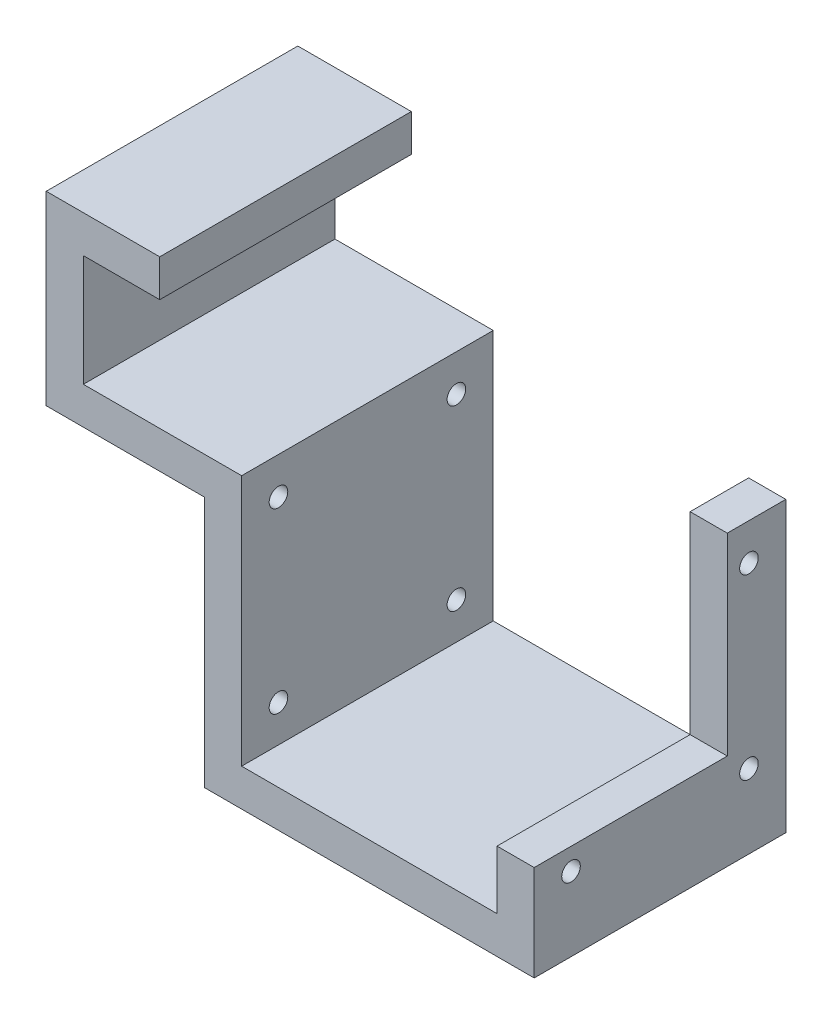
ISO-10303-21;
HEADER;
FILE_DESCRIPTION(('STEP AP214'),'2;1');
FILE_NAME('part.step','',(''),(''),'','','');
FILE_SCHEMA(('AUTOMOTIVE_DESIGN { 1 0 10303 214 1 1 1 1 }'));
ENDSEC;
DATA;
#1=APPLICATION_CONTEXT('core data for automotive mechanical design processes');
#2=APPLICATION_PROTOCOL_DEFINITION('international standard','automotive_design',2000,#1);
#3=PRODUCT_CONTEXT('',#1,'mechanical');
#4=PRODUCT('Part','Part','',(#3));
#5=PRODUCT_RELATED_PRODUCT_CATEGORY('part','',(#4));
#6=PRODUCT_DEFINITION_FORMATION('','',#4);
#7=PRODUCT_DEFINITION_CONTEXT('part definition',#1,'design');
#8=PRODUCT_DEFINITION('design','',#6,#7);
#9=PRODUCT_DEFINITION_SHAPE('','',#8);
#10=(LENGTH_UNIT() NAMED_UNIT(*) SI_UNIT(.MILLI.,.METRE.));
#11=(NAMED_UNIT(*) PLANE_ANGLE_UNIT() SI_UNIT($,.RADIAN.));
#12=(NAMED_UNIT(*) SI_UNIT($,.STERADIAN.) SOLID_ANGLE_UNIT());
#13=UNCERTAINTY_MEASURE_WITH_UNIT(LENGTH_MEASURE(1.E-05),#10,'distance_accuracy_value','');
#14=(GEOMETRIC_REPRESENTATION_CONTEXT(3) GLOBAL_UNCERTAINTY_ASSIGNED_CONTEXT((#13)) GLOBAL_UNIT_ASSIGNED_CONTEXT((#10,
#11,#12)) REPRESENTATION_CONTEXT('',''));
#15=CARTESIAN_POINT('',(0.,0.,0.));
#16=DIRECTION('',(0.,0.,1.));
#17=DIRECTION('',(1.,0.,0.));
#18=AXIS2_PLACEMENT_3D('',#15,#16,#17);
#19=CARTESIAN_POINT('',(-6.35,15.15,-150.351129477058));
#20=DIRECTION('',(0.,1.,0.));
#21=DIRECTION('',(0.,0.,1.));
#22=AXIS2_PLACEMENT_3D('',#19,#20,#21);
#23=PLANE('',#22);
#24=DIRECTION('',(-1.,0.,0.));
#25=VECTOR('',#24,1.);
#26=CARTESIAN_POINT('',(50.,15.15,-38.2923438834319));
#27=LINE('',#26,#25);
#28=CARTESIAN_POINT('',(-19.05,15.15,-38.2923438834319));
#29=VERTEX_POINT('',#28);
#30=CARTESIAN_POINT('',(-6.35,15.15,-38.2923438834319));
#31=VERTEX_POINT('',#30);
#32=EDGE_CURVE('E189',#29,#31,#27,.F.);
#33=ORIENTED_EDGE('',*,*,#32,.F.);
#34=DIRECTION('',(0.,0.,1.));
#35=VECTOR('',#34,1.);
#36=CARTESIAN_POINT('',(-19.05,15.15,-150.351129477058));
#37=LINE('',#36,#35);
#38=CARTESIAN_POINT('',(-19.05,15.15,-35.1193076505862));
#39=VERTEX_POINT('',#38);
#40=EDGE_CURVE('E11',#29,#39,#37,.T.);
#41=ORIENTED_EDGE('',*,*,#40,.T.);
#42=DIRECTION('',(-1.,0.,0.));
#43=VECTOR('',#42,1.);
#44=CARTESIAN_POINT('',(50.,15.15,-35.1193076505862));
#45=LINE('',#44,#43);
#46=CARTESIAN_POINT('',(-6.35,15.15,-35.1193076505862));
#47=VERTEX_POINT('',#46);
#48=EDGE_CURVE('E191',#47,#39,#45,.T.);
#49=ORIENTED_EDGE('',*,*,#48,.F.);
#50=DIRECTION('',(0.,0.,1.));
#51=VECTOR('',#50,1.);
#52=CARTESIAN_POINT('',(-6.35,15.15,-150.351129477058));
#53=LINE('',#52,#51);
#54=CARTESIAN_POINT('',(-6.35,15.15,-7.88069234941382));
#55=VERTEX_POINT('',#54);
#56=EDGE_CURVE('E398',#47,#55,#53,.T.);
#57=ORIENTED_EDGE('',*,*,#56,.T.);
#58=DIRECTION('',(-1.,0.,0.));
#59=VECTOR('',#58,1.);
#60=CARTESIAN_POINT('',(50.,15.15,-7.88069234941382));
#61=LINE('',#60,#59);
#62=CARTESIAN_POINT('',(-19.05,15.15,-7.88069234941382));
#63=VERTEX_POINT('',#62);
#64=EDGE_CURVE('E56',#63,#55,#61,.F.);
#65=ORIENTED_EDGE('',*,*,#64,.F.);
#66=DIRECTION('',(0.,0.,1.));
#67=VECTOR('',#66,1.);
#68=CARTESIAN_POINT('',(-19.05,15.15,-150.351129477058));
#69=LINE('',#68,#67);
#70=CARTESIAN_POINT('',(-19.05,15.15,-4.70765611656815));
#71=VERTEX_POINT('',#70);
#72=EDGE_CURVE('E343',#63,#71,#69,.T.);
#73=ORIENTED_EDGE('',*,*,#72,.T.);
#74=DIRECTION('',(-1.,0.,0.));
#75=VECTOR('',#74,1.);
#76=CARTESIAN_POINT('',(50.,15.15,-4.70765611656815));
#77=LINE('',#76,#75);
#78=CARTESIAN_POINT('',(-6.35,15.15,-4.70765611656815));
#79=VERTEX_POINT('',#78);
#80=EDGE_CURVE('E410',#79,#71,#77,.T.);
#81=ORIENTED_EDGE('',*,*,#80,.F.);
#82=CARTESIAN_POINT('',(-6.35,15.15,0.));
#83=VERTEX_POINT('',#82);
#84=EDGE_CURVE('E309',#79,#83,#53,.T.);
#85=ORIENTED_EDGE('',*,*,#84,.T.);
#86=DIRECTION('',(-1.,0.,0.));
#87=VECTOR('',#86,1.);
#88=CARTESIAN_POINT('',(-6.35,15.15,0.));
#89=LINE('',#88,#87);
#90=CARTESIAN_POINT('',(-33.4,15.15,0.));
#91=VERTEX_POINT('',#90);
#92=EDGE_CURVE('E301',#83,#91,#89,.T.);
#93=ORIENTED_EDGE('',*,*,#92,.T.);
#94=DIRECTION('',(0.,0.,1.));
#95=VECTOR('',#94,1.);
#96=CARTESIAN_POINT('',(-33.4,15.15,-150.351129477058));
#97=LINE('',#96,#95);
#98=CARTESIAN_POINT('',(-33.4,15.15,-43.));
#99=VERTEX_POINT('',#98);
#100=EDGE_CURVE('E300',#99,#91,#97,.T.);
#101=ORIENTED_EDGE('',*,*,#100,.F.);
#102=DIRECTION('',(-1.,0.,0.));
#103=VECTOR('',#102,1.);
#104=CARTESIAN_POINT('',(-6.35,15.15,-43.));
#105=LINE('',#104,#103);
#106=CARTESIAN_POINT('',(-6.35,15.15,-43.));
#107=VERTEX_POINT('',#106);
#108=EDGE_CURVE('E348',#107,#99,#105,.T.);
#109=ORIENTED_EDGE('',*,*,#108,.F.);
#110=EDGE_CURVE('E198',#107,#31,#53,.T.);
#111=ORIENTED_EDGE('',*,*,#110,.T.);
#112=EDGE_LOOP('',(#33,#41,#49,#57,#65,#73,#81,#85,#93,#101,#109,#111));
#113=FACE_BOUND('',#112,.T.);
#114=ADVANCED_FACE('F47',(#113),#23,.F.);
#115=CARTESIAN_POINT('',(-14.,40.55,-150.351129477058));
#116=DIRECTION('',(0.,1.,0.));
#117=DIRECTION('',(0.,0.,1.));
#118=AXIS2_PLACEMENT_3D('',#115,#116,#117);
#119=PLANE('',#118);
#120=DIRECTION('',(-1.,0.,0.));
#121=VECTOR('',#120,1.);
#122=CARTESIAN_POINT('',(-14.,40.55,-43.));
#123=LINE('',#122,#121);
#124=CARTESIAN_POINT('',(-14.,40.55,-43.));
#125=VERTEX_POINT('',#124);
#126=CARTESIAN_POINT('',(-27.05,40.55,-43.));
#127=VERTEX_POINT('',#126);
#128=EDGE_CURVE('E376',#125,#127,#123,.T.);
#129=ORIENTED_EDGE('',*,*,#128,.F.);
#130=DIRECTION('',(0.,0.,1.));
#131=VECTOR('',#130,1.);
#132=CARTESIAN_POINT('',(-14.,40.55,-150.351129477058));
#133=LINE('',#132,#131);
#134=CARTESIAN_POINT('',(-14.,40.55,0.));
#135=VERTEX_POINT('',#134);
#136=EDGE_CURVE('E284',#125,#135,#133,.T.);
#137=ORIENTED_EDGE('',*,*,#136,.T.);
#138=DIRECTION('',(-1.,0.,0.));
#139=VECTOR('',#138,1.);
#140=CARTESIAN_POINT('',(-14.,40.55,0.));
#141=LINE('',#140,#139);
#142=CARTESIAN_POINT('',(-27.05,40.55,0.));
#143=VERTEX_POINT('',#142);
#144=EDGE_CURVE('E335',#135,#143,#141,.T.);
#145=ORIENTED_EDGE('',*,*,#144,.T.);
#146=DIRECTION('',(0.,0.,1.));
#147=VECTOR('',#146,1.);
#148=CARTESIAN_POINT('',(-27.05,40.55,-150.351129477058));
#149=LINE('',#148,#147);
#150=EDGE_CURVE('E334',#127,#143,#149,.T.);
#151=ORIENTED_EDGE('',*,*,#150,.F.);
#152=EDGE_LOOP('',(#129,#137,#145,#151));
#153=FACE_BOUND('',#152,.T.);
#154=ADVANCED_FACE('F477',(#153),#119,.F.);
#155=CARTESIAN_POINT('',(-27.05,40.55,-150.351129477058));
#156=DIRECTION('',(-1.,0.,0.));
#157=DIRECTION('',(0.,0.,1.));
#158=AXIS2_PLACEMENT_3D('',#155,#156,#157);
#159=PLANE('',#158);
#160=DIRECTION('',(0.,-1.,0.));
#161=VECTOR('',#160,1.);
#162=CARTESIAN_POINT('',(-27.05,40.5499999999999,-43.));
#163=LINE('',#162,#161);
#164=CARTESIAN_POINT('',(-27.05,21.5,-43.));
#165=VERTEX_POINT('',#164);
#166=EDGE_CURVE('E372',#127,#165,#163,.T.);
#167=ORIENTED_EDGE('',*,*,#166,.F.);
#168=ORIENTED_EDGE('',*,*,#150,.T.);
#169=DIRECTION('',(0.,-1.,0.));
#170=VECTOR('',#169,1.);
#171=CARTESIAN_POINT('',(-27.05,40.55,0.));
#172=LINE('',#171,#170);
#173=CARTESIAN_POINT('',(-27.05,21.5,0.));
#174=VERTEX_POINT('',#173);
#175=EDGE_CURVE('E330',#143,#174,#172,.T.);
#176=ORIENTED_EDGE('',*,*,#175,.T.);
#177=DIRECTION('',(0.,0.,1.));
#178=VECTOR('',#177,1.);
#179=CARTESIAN_POINT('',(-27.05,21.5,-150.351129477058));
#180=LINE('',#179,#178);
#181=EDGE_CURVE('E329',#165,#174,#180,.T.);
#182=ORIENTED_EDGE('',*,*,#181,.F.);
#183=EDGE_LOOP('',(#167,#168,#176,#182));
#184=FACE_BOUND('',#183,.T.);
#185=ADVANCED_FACE('F483',(#184),#159,.F.);
#186=CARTESIAN_POINT('',(-27.05,21.5,-150.351129477058));
#187=DIRECTION('',(0.,-1.,0.));
#188=DIRECTION('',(0.,0.,-1.));
#189=AXIS2_PLACEMENT_3D('',#186,#187,#188);
#190=PLANE('',#189);
#191=DIRECTION('',(1.,0.,0.));
#192=VECTOR('',#191,1.);
#193=CARTESIAN_POINT('',(-27.05,21.5,-43.));
#194=LINE('',#193,#192);
#195=CARTESIAN_POINT('',(0.,21.5,-43.));
#196=VERTEX_POINT('',#195);
#197=EDGE_CURVE('E368',#165,#196,#194,.T.);
#198=ORIENTED_EDGE('',*,*,#197,.F.);
#199=ORIENTED_EDGE('',*,*,#181,.T.);
#200=DIRECTION('',(1.,0.,0.));
#201=VECTOR('',#200,1.);
#202=CARTESIAN_POINT('',(-27.05,21.5,0.));
#203=LINE('',#202,#201);
#204=CARTESIAN_POINT('',(0.,21.5,0.));
#205=VERTEX_POINT('',#204);
#206=EDGE_CURVE('E325',#174,#205,#203,.T.);
#207=ORIENTED_EDGE('',*,*,#206,.T.);
#208=DIRECTION('',(0.,0.,1.));
#209=VECTOR('',#208,1.);
#210=CARTESIAN_POINT('',(0.,21.5,-150.351129477058));
#211=LINE('',#210,#209);
#212=EDGE_CURVE('E324',#196,#205,#211,.T.);
#213=ORIENTED_EDGE('',*,*,#212,.F.);
#214=EDGE_LOOP('',(#198,#199,#207,#213));
#215=FACE_BOUND('',#214,.T.);
#216=ADVANCED_FACE('F468',(#215),#190,.F.);
#217=CARTESIAN_POINT('',(0.,21.5,-150.351129477058));
#218=DIRECTION('',(-1.,0.,0.));
#219=DIRECTION('',(0.,-1.,0.));
#220=AXIS2_PLACEMENT_3D('',#217,#218,#219);
#221=PLANE('',#220);
#222=CARTESIAN_POINT('',(0.,-15.205825767009,-6.29417423299098));
#223=DIRECTION('',(-1.,0.,0.));
#224=DIRECTION('',(0.,-1.,0.));
#225=AXIS2_PLACEMENT_3D('',#222,#223,#224);
#226=CIRCLE('',#225,1.5875);
#227=CARTESIAN_POINT('',(0.,-16.793325767009,-6.29417423299098));
#228=VERTEX_POINT('',#227);
#229=EDGE_CURVE('E218',#228,#228,#226,.F.);
#230=ORIENTED_EDGE('',*,*,#229,.F.);
#231=EDGE_LOOP('',(#230));
#232=FACE_BOUND('',#231,.T.);
#233=CARTESIAN_POINT('',(0.,15.2058257670091,-36.7058257670091));
#234=DIRECTION('',(-1.,0.,0.));
#235=DIRECTION('',(0.,-1.,0.));
#236=AXIS2_PLACEMENT_3D('',#233,#234,#235);
#237=CIRCLE('',#236,1.5875);
#238=CARTESIAN_POINT('',(0.,13.6183257670091,-36.7058257670091));
#239=VERTEX_POINT('',#238);
#240=EDGE_CURVE('E200',#239,#239,#237,.F.);
#241=ORIENTED_EDGE('',*,*,#240,.F.);
#242=EDGE_LOOP('',(#241));
#243=FACE_BOUND('',#242,.T.);
#244=CARTESIAN_POINT('',(0.,15.2058257670091,-6.29417423299098));
#245=DIRECTION('',(-1.,0.,0.));
#246=DIRECTION('',(0.,-1.,0.));
#247=AXIS2_PLACEMENT_3D('',#244,#245,#246);
#248=CIRCLE('',#247,1.5875);
#249=CARTESIAN_POINT('',(0.,13.6183257670091,-6.29417423299098));
#250=VERTEX_POINT('',#249);
#251=EDGE_CURVE('E225',#250,#250,#248,.F.);
#252=ORIENTED_EDGE('',*,*,#251,.F.);
#253=EDGE_LOOP('',(#252));
#254=FACE_BOUND('',#253,.T.);
#255=CARTESIAN_POINT('',(0.,-15.205825767009,-36.7058257670091));
#256=DIRECTION('',(-1.,0.,0.));
#257=DIRECTION('',(0.,-1.,0.));
#258=AXIS2_PLACEMENT_3D('',#255,#256,#257);
#259=CIRCLE('',#258,1.5875);
#260=CARTESIAN_POINT('',(0.,-16.793325767009,-36.7058257670091));
#261=VERTEX_POINT('',#260);
#262=EDGE_CURVE('E518',#261,#261,#259,.F.);
#263=ORIENTED_EDGE('',*,*,#262,.F.);
#264=EDGE_LOOP('',(#263));
#265=FACE_BOUND('',#264,.T.);
#266=DIRECTION('',(0.,-1.,0.));
#267=VECTOR('',#266,1.);
#268=CARTESIAN_POINT('',(0.,21.5,-43.));
#269=LINE('',#268,#267);
#270=CARTESIAN_POINT('',(0.,-21.5,-43.));
#271=VERTEX_POINT('',#270);
#272=EDGE_CURVE('E364',#196,#271,#269,.T.);
#273=ORIENTED_EDGE('',*,*,#272,.F.);
#274=ORIENTED_EDGE('',*,*,#212,.T.);
#275=DIRECTION('',(0.,-1.,0.));
#276=VECTOR('',#275,1.);
#277=CARTESIAN_POINT('',(0.,21.5,0.));
#278=LINE('',#277,#276);
#279=CARTESIAN_POINT('',(0.,-21.5,0.));
#280=VERTEX_POINT('',#279);
#281=EDGE_CURVE('E320',#205,#280,#278,.T.);
#282=ORIENTED_EDGE('',*,*,#281,.T.);
#283=DIRECTION('',(0.,0.,1.));
#284=VECTOR('',#283,1.);
#285=CARTESIAN_POINT('',(0.,-21.5,-150.351129477058));
#286=LINE('',#285,#284);
#287=EDGE_CURVE('E319',#271,#280,#286,.T.);
#288=ORIENTED_EDGE('',*,*,#287,.F.);
#289=EDGE_LOOP('',(#273,#274,#282,#288));
#290=FACE_BOUND('',#289,.T.);
#291=ADVANCED_FACE('F466',(#232,#243,#254,#265,#290),#221,.F.);
#292=CARTESIAN_POINT('',(0.,-21.5,-150.351129477058));
#293=DIRECTION('',(0.,-1.,0.));
#294=DIRECTION('',(0.,0.,-1.));
#295=AXIS2_PLACEMENT_3D('',#292,#293,#294);
#296=PLANE('',#295);
#297=DIRECTION('',(1.,0.,0.));
#298=VECTOR('',#297,1.);
#299=CARTESIAN_POINT('',(0.,-21.5,-43.));
#300=LINE('',#299,#298);
#301=CARTESIAN_POINT('',(43.65,-21.5,-43.));
#302=VERTEX_POINT('',#301);
#303=EDGE_CURVE('E360',#271,#302,#300,.T.);
#304=ORIENTED_EDGE('',*,*,#303,.F.);
#305=ORIENTED_EDGE('',*,*,#287,.T.);
#306=DIRECTION('',(1.,0.,0.));
#307=VECTOR('',#306,1.);
#308=CARTESIAN_POINT('',(0.,-21.5,0.));
#309=LINE('',#308,#307);
#310=CARTESIAN_POINT('',(43.65,-21.5,0.));
#311=VERTEX_POINT('',#310);
#312=EDGE_CURVE('E316',#280,#311,#309,.T.);
#313=ORIENTED_EDGE('',*,*,#312,.T.);
#314=DIRECTION('',(0.,0.,1.));
#315=VECTOR('',#314,1.);
#316=CARTESIAN_POINT('',(43.65,-21.5,-150.351129477058));
#317=LINE('',#316,#315);
#318=EDGE_CURVE('E315',#302,#311,#317,.T.);
#319=ORIENTED_EDGE('',*,*,#318,.F.);
#320=EDGE_LOOP('',(#304,#305,#313,#319));
#321=FACE_BOUND('',#320,.T.);
#322=ADVANCED_FACE('F461',(#321),#296,.F.);
#323=CARTESIAN_POINT('',(43.65,-27.8499999999999,-150.351129477058));
#324=DIRECTION('',(0.,1.,0.));
#325=DIRECTION('',(-1.,0.,0.));
#326=AXIS2_PLACEMENT_3D('',#323,#324,#325);
#327=PLANE('',#326);
#328=DIRECTION('',(-1.,0.,0.));
#329=VECTOR('',#328,1.);
#330=CARTESIAN_POINT('',(43.65,-27.8499999999999,-43.));
#331=LINE('',#330,#329);
#332=CARTESIAN_POINT('',(50.,-27.8499999999999,-43.));
#333=VERTEX_POINT('',#332);
#334=CARTESIAN_POINT('',(-6.35,-27.85,-43.));
#335=VERTEX_POINT('',#334);
#336=EDGE_CURVE('E356',#333,#335,#331,.T.);
#337=ORIENTED_EDGE('',*,*,#336,.F.);
#338=DIRECTION('',(0.,0.,-1.));
#339=VECTOR('',#338,1.);
#340=CARTESIAN_POINT('',(50.,-27.8499999999999,0.));
#341=LINE('',#340,#339);
#342=CARTESIAN_POINT('',(50.,-27.8499999999999,0.));
#343=VERTEX_POINT('',#342);
#344=EDGE_CURVE('E230',#343,#333,#341,.T.);
#345=ORIENTED_EDGE('',*,*,#344,.F.);
#346=DIRECTION('',(-1.,0.,0.));
#347=VECTOR('',#346,1.);
#348=CARTESIAN_POINT('',(43.65,-27.8499999999999,0.));
#349=LINE('',#348,#347);
#350=CARTESIAN_POINT('',(-6.35,-27.85,0.));
#351=VERTEX_POINT('',#350);
#352=EDGE_CURVE('E311',#343,#351,#349,.T.);
#353=ORIENTED_EDGE('',*,*,#352,.T.);
#354=DIRECTION('',(0.,0.,1.));
#355=VECTOR('',#354,1.);
#356=CARTESIAN_POINT('',(-6.35,-27.85,-150.351129477058));
#357=LINE('',#356,#355);
#358=EDGE_CURVE('E310',#335,#351,#357,.T.);
#359=ORIENTED_EDGE('',*,*,#358,.F.);
#360=EDGE_LOOP('',(#337,#345,#353,#359));
#361=FACE_BOUND('',#360,.T.);
#362=ADVANCED_FACE('F443',(#361),#327,.F.);
#363=CARTESIAN_POINT('',(-6.35,-27.85,-150.351129477058));
#364=DIRECTION('',(1.,0.,0.));
#365=DIRECTION('',(0.,1.,0.));
#366=AXIS2_PLACEMENT_3D('',#363,#364,#365);
#367=PLANE('',#366);
#368=CARTESIAN_POINT('',(-6.35,-15.205825767009,-6.29417423299098));
#369=DIRECTION('',(1.,0.,0.));
#370=DIRECTION('',(0.,1.,0.));
#371=AXIS2_PLACEMENT_3D('',#368,#369,#370);
#372=CIRCLE('',#371,1.5875);
#373=CARTESIAN_POINT('',(-6.35,-13.618325767009,-6.29417423299098));
#374=VERTEX_POINT('',#373);
#375=EDGE_CURVE('E214',#374,#374,#372,.F.);
#376=ORIENTED_EDGE('',*,*,#375,.F.);
#377=EDGE_LOOP('',(#376));
#378=FACE_BOUND('',#377,.T.);
#379=CARTESIAN_POINT('',(-6.35,15.2058257670091,-36.7058257670091));
#380=DIRECTION('',(1.,0.,0.));
#381=DIRECTION('',(0.,1.,0.));
#382=AXIS2_PLACEMENT_3D('',#379,#380,#381);
#383=CIRCLE('',#382,1.5875);
#384=EDGE_CURVE('E201',#31,#47,#383,.F.);
#385=ORIENTED_EDGE('',*,*,#384,.F.);
#386=ORIENTED_EDGE('',*,*,#110,.F.);
#387=DIRECTION('',(0.,1.,0.));
#388=VECTOR('',#387,1.);
#389=CARTESIAN_POINT('',(-6.35,-27.85,-43.));
#390=LINE('',#389,#388);
#391=EDGE_CURVE('E352',#335,#107,#390,.T.);
#392=ORIENTED_EDGE('',*,*,#391,.F.);
#393=ORIENTED_EDGE('',*,*,#358,.T.);
#394=DIRECTION('',(0.,1.,0.));
#395=VECTOR('',#394,1.);
#396=CARTESIAN_POINT('',(-6.35,-27.85,0.));
#397=LINE('',#396,#395);
#398=EDGE_CURVE('E305',#351,#83,#397,.T.);
#399=ORIENTED_EDGE('',*,*,#398,.T.);
#400=ORIENTED_EDGE('',*,*,#84,.F.);
#401=CARTESIAN_POINT('',(-6.35,15.2058257670091,-6.29417423299098));
#402=DIRECTION('',(1.,0.,0.));
#403=DIRECTION('',(0.,1.,0.));
#404=AXIS2_PLACEMENT_3D('',#401,#402,#403);
#405=CIRCLE('',#404,1.5875);
#406=EDGE_CURVE('E222',#55,#79,#405,.F.);
#407=ORIENTED_EDGE('',*,*,#406,.F.);
#408=ORIENTED_EDGE('',*,*,#56,.F.);
#409=EDGE_LOOP('',(#385,#386,#392,#393,#399,#400,#407,#408));
#410=FACE_BOUND('',#409,.T.);
#411=CARTESIAN_POINT('',(-6.35,-15.205825767009,-36.7058257670091));
#412=DIRECTION('',(1.,0.,0.));
#413=DIRECTION('',(0.,1.,0.));
#414=AXIS2_PLACEMENT_3D('',#411,#412,#413);
#415=CIRCLE('',#414,1.5875);
#416=CARTESIAN_POINT('',(-6.35,-13.618325767009,-36.7058257670091));
#417=VERTEX_POINT('',#416);
#418=EDGE_CURVE('E522',#417,#417,#415,.F.);
#419=ORIENTED_EDGE('',*,*,#418,.F.);
#420=EDGE_LOOP('',(#419));
#421=FACE_BOUND('',#420,.T.);
#422=ADVANCED_FACE('F423',(#378,#410,#421),#367,.F.);
#423=CARTESIAN_POINT('',(-33.4,15.15,-150.351129477058));
#424=DIRECTION('',(1.,0.,0.));
#425=DIRECTION('',(0.,1.,0.));
#426=AXIS2_PLACEMENT_3D('',#423,#424,#425);
#427=PLANE('',#426);
#428=DIRECTION('',(0.,1.,0.));
#429=VECTOR('',#428,1.);
#430=CARTESIAN_POINT('',(-33.4,15.15,-43.));
#431=LINE('',#430,#429);
#432=CARTESIAN_POINT('',(-33.3999999999999,46.9,-43.));
#433=VERTEX_POINT('',#432);
#434=EDGE_CURVE('E344',#99,#433,#431,.T.);
#435=ORIENTED_EDGE('',*,*,#434,.F.);
#436=ORIENTED_EDGE('',*,*,#100,.T.);
#437=DIRECTION('',(0.,1.,0.));
#438=VECTOR('',#437,1.);
#439=CARTESIAN_POINT('',(-33.4,15.15,0.));
#440=LINE('',#439,#438);
#441=CARTESIAN_POINT('',(-33.3999999999999,46.9,0.));
#442=VERTEX_POINT('',#441);
#443=EDGE_CURVE('E296',#91,#442,#440,.T.);
#444=ORIENTED_EDGE('',*,*,#443,.T.);
#445=DIRECTION('',(0.,0.,1.));
#446=VECTOR('',#445,1.);
#447=CARTESIAN_POINT('',(-33.3999999999999,46.9,-150.351129477058));
#448=LINE('',#447,#446);
#449=EDGE_CURVE('E295',#433,#442,#448,.T.);
#450=ORIENTED_EDGE('',*,*,#449,.F.);
#451=EDGE_LOOP('',(#435,#436,#444,#450));
#452=FACE_BOUND('',#451,.T.);
#453=ADVANCED_FACE('F439',(#452),#427,.F.);
#454=CARTESIAN_POINT('',(-33.3999999999999,46.9,-150.351129477058));
#455=DIRECTION('',(0.,-1.,0.));
#456=DIRECTION('',(1.,0.,0.));
#457=AXIS2_PLACEMENT_3D('',#454,#455,#456);
#458=PLANE('',#457);
#459=DIRECTION('',(1.,0.,0.));
#460=VECTOR('',#459,1.);
#461=CARTESIAN_POINT('',(-33.3999999999999,46.9,-43.));
#462=LINE('',#461,#460);
#463=CARTESIAN_POINT('',(-14.,46.9,-43.));
#464=VERTEX_POINT('',#463);
#465=EDGE_CURVE('E339',#433,#464,#462,.T.);
#466=ORIENTED_EDGE('',*,*,#465,.F.);
#467=ORIENTED_EDGE('',*,*,#449,.T.);
#468=DIRECTION('',(1.,0.,0.));
#469=VECTOR('',#468,1.);
#470=CARTESIAN_POINT('',(-33.3999999999999,46.9,0.));
#471=LINE('',#470,#469);
#472=CARTESIAN_POINT('',(-14.,46.9,0.));
#473=VERTEX_POINT('',#472);
#474=EDGE_CURVE('E291',#442,#473,#471,.T.);
#475=ORIENTED_EDGE('',*,*,#474,.T.);
#476=DIRECTION('',(0.,0.,1.));
#477=VECTOR('',#476,1.);
#478=CARTESIAN_POINT('',(-14.,46.9,-150.351129477058));
#479=LINE('',#478,#477);
#480=EDGE_CURVE('E290',#464,#473,#479,.T.);
#481=ORIENTED_EDGE('',*,*,#480,.F.);
#482=EDGE_LOOP('',(#466,#467,#475,#481));
#483=FACE_BOUND('',#482,.T.);
#484=ADVANCED_FACE('F482',(#483),#458,.F.);
#485=CARTESIAN_POINT('',(-14.,46.9,-150.351129477058));
#486=DIRECTION('',(-1.,0.,0.));
#487=DIRECTION('',(0.,0.,1.));
#488=AXIS2_PLACEMENT_3D('',#485,#486,#487);
#489=PLANE('',#488);
#490=DIRECTION('',(0.,-1.,0.));
#491=VECTOR('',#490,1.);
#492=CARTESIAN_POINT('',(-14.,46.8999999999999,-43.));
#493=LINE('',#492,#491);
#494=EDGE_CURVE('E289',#464,#125,#493,.T.);
#495=ORIENTED_EDGE('',*,*,#494,.F.);
#496=ORIENTED_EDGE('',*,*,#480,.T.);
#497=DIRECTION('',(0.,-1.,0.));
#498=VECTOR('',#497,1.);
#499=CARTESIAN_POINT('',(-14.,46.9,0.));
#500=LINE('',#499,#498);
#501=EDGE_CURVE('E285',#473,#135,#500,.T.);
#502=ORIENTED_EDGE('',*,*,#501,.T.);
#503=ORIENTED_EDGE('',*,*,#136,.F.);
#504=EDGE_LOOP('',(#495,#496,#502,#503));
#505=FACE_BOUND('',#504,.T.);
#506=ADVANCED_FACE('F480',(#505),#489,.F.);
#507=CARTESIAN_POINT('',(0.,0.,0.));
#508=DIRECTION('',(0.,0.,1.));
#509=DIRECTION('',(1.,0.,0.));
#510=AXIS2_PLACEMENT_3D('',#507,#508,#509);
#511=PLANE('',#510);
#512=ORIENTED_EDGE('',*,*,#144,.F.);
#513=ORIENTED_EDGE('',*,*,#501,.F.);
#514=ORIENTED_EDGE('',*,*,#474,.F.);
#515=ORIENTED_EDGE('',*,*,#443,.F.);
#516=ORIENTED_EDGE('',*,*,#92,.F.);
#517=ORIENTED_EDGE('',*,*,#398,.F.);
#518=ORIENTED_EDGE('',*,*,#352,.F.);
#519=DIRECTION('',(0.,-1.,0.));
#520=VECTOR('',#519,1.);
#521=CARTESIAN_POINT('',(50.,0.,0.));
#522=LINE('',#521,#520);
#523=CARTESIAN_POINT('',(50.,-11.4999999999999,0.));
#524=VERTEX_POINT('',#523);
#525=EDGE_CURVE('E250',#524,#343,#522,.T.);
#526=ORIENTED_EDGE('',*,*,#525,.F.);
#527=DIRECTION('',(-1.,0.,0.));
#528=VECTOR('',#527,1.);
#529=CARTESIAN_POINT('',(50.,-11.4999999999999,0.));
#530=LINE('',#529,#528);
#531=CARTESIAN_POINT('',(43.65,-11.4999999999999,0.));
#532=VERTEX_POINT('',#531);
#533=EDGE_CURVE('E254',#524,#532,#530,.T.);
#534=ORIENTED_EDGE('',*,*,#533,.T.);
#535=DIRECTION('',(0.,-1.,0.));
#536=VECTOR('',#535,1.);
#537=CARTESIAN_POINT('',(43.65,0.,0.));
#538=LINE('',#537,#536);
#539=EDGE_CURVE('E235',#532,#311,#538,.T.);
#540=ORIENTED_EDGE('',*,*,#539,.T.);
#541=ORIENTED_EDGE('',*,*,#312,.F.);
#542=ORIENTED_EDGE('',*,*,#281,.F.);
#543=ORIENTED_EDGE('',*,*,#206,.F.);
#544=ORIENTED_EDGE('',*,*,#175,.F.);
#545=EDGE_LOOP('',(#512,#513,#514,#515,#516,#517,#518,#526,#534,#540,#541,#542,#543,#544));
#546=FACE_BOUND('',#545,.T.);
#547=ADVANCED_FACE('F434',(#546),#511,.T.);
#548=CARTESIAN_POINT('',(33.,0.,-43.));
#549=DIRECTION('',(0.,0.,-1.));
#550=DIRECTION('',(-1.,0.,0.));
#551=AXIS2_PLACEMENT_3D('',#548,#549,#550);
#552=PLANE('',#551);
#553=ORIENTED_EDGE('',*,*,#494,.T.);
#554=ORIENTED_EDGE('',*,*,#128,.T.);
#555=ORIENTED_EDGE('',*,*,#166,.T.);
#556=ORIENTED_EDGE('',*,*,#197,.T.);
#557=ORIENTED_EDGE('',*,*,#272,.T.);
#558=ORIENTED_EDGE('',*,*,#303,.T.);
#559=DIRECTION('',(0.,1.,0.));
#560=VECTOR('',#559,1.);
#561=CARTESIAN_POINT('',(43.65,0.,-43.));
#562=LINE('',#561,#560);
#563=CARTESIAN_POINT('',(43.65,21.5000000000001,-43.));
#564=VERTEX_POINT('',#563);
#565=EDGE_CURVE('E229',#302,#564,#562,.T.);
#566=ORIENTED_EDGE('',*,*,#565,.T.);
#567=DIRECTION('',(-1.,0.,0.));
#568=VECTOR('',#567,1.);
#569=CARTESIAN_POINT('',(50.,21.5000000000001,-43.));
#570=LINE('',#569,#568);
#571=CARTESIAN_POINT('',(50.,21.5000000000001,-43.));
#572=VERTEX_POINT('',#571);
#573=EDGE_CURVE('E280',#572,#564,#570,.T.);
#574=ORIENTED_EDGE('',*,*,#573,.F.);
#575=DIRECTION('',(0.,1.,0.));
#576=VECTOR('',#575,1.);
#577=CARTESIAN_POINT('',(50.,0.,-43.));
#578=LINE('',#577,#576);
#579=EDGE_CURVE('E234',#333,#572,#578,.T.);
#580=ORIENTED_EDGE('',*,*,#579,.F.);
#581=ORIENTED_EDGE('',*,*,#336,.T.);
#582=ORIENTED_EDGE('',*,*,#391,.T.);
#583=ORIENTED_EDGE('',*,*,#108,.T.);
#584=ORIENTED_EDGE('',*,*,#434,.T.);
#585=ORIENTED_EDGE('',*,*,#465,.T.);
#586=EDGE_LOOP('',(#553,#554,#555,#556,#557,#558,#566,#574,#580,#581,#582,#583,#584,#585));
#587=FACE_BOUND('',#586,.T.);
#588=ADVANCED_FACE('F49',(#587),#552,.T.);
#589=CARTESIAN_POINT('',(43.65,0.,0.));
#590=DIRECTION('',(1.,0.,0.));
#591=DIRECTION('',(0.,0.,-1.));
#592=AXIS2_PLACEMENT_3D('',#589,#590,#591);
#593=PLANE('',#592);
#594=CARTESIAN_POINT('',(43.65,-15.205825767009,-6.29417423299098));
#595=DIRECTION('',(1.,0.,0.));
#596=DIRECTION('',(0.,0.,-1.));
#597=AXIS2_PLACEMENT_3D('',#594,#595,#596);
#598=CIRCLE('',#597,1.5875);
#599=CARTESIAN_POINT('',(43.65,-15.205825767009,-7.88167423299098));
#600=VERTEX_POINT('',#599);
#601=EDGE_CURVE('E206',#600,#600,#598,.F.);
#602=ORIENTED_EDGE('',*,*,#601,.F.);
#603=EDGE_LOOP('',(#602));
#604=FACE_BOUND('',#603,.T.);
#605=CARTESIAN_POINT('',(43.65,15.2058257670091,-36.7058257670091));
#606=DIRECTION('',(1.,0.,0.));
#607=DIRECTION('',(0.,0.,-1.));
#608=AXIS2_PLACEMENT_3D('',#605,#606,#607);
#609=CIRCLE('',#608,1.5875);
#610=CARTESIAN_POINT('',(43.65,15.2058257670091,-38.2933257670091));
#611=VERTEX_POINT('',#610);
#612=EDGE_CURVE('E521',#611,#611,#609,.F.);
#613=ORIENTED_EDGE('',*,*,#612,.F.);
#614=EDGE_LOOP('',(#613));
#615=FACE_BOUND('',#614,.T.);
#616=CARTESIAN_POINT('',(43.65,-15.205825767009,-36.7058257670091));
#617=DIRECTION('',(1.,0.,0.));
#618=DIRECTION('',(0.,0.,-1.));
#619=AXIS2_PLACEMENT_3D('',#616,#617,#618);
#620=CIRCLE('',#619,1.5875);
#621=CARTESIAN_POINT('',(43.65,-15.205825767009,-38.2933257670091));
#622=VERTEX_POINT('',#621);
#623=EDGE_CURVE('E529',#622,#622,#620,.F.);
#624=ORIENTED_EDGE('',*,*,#623,.F.);
#625=EDGE_LOOP('',(#624));
#626=FACE_BOUND('',#625,.T.);
#627=ORIENTED_EDGE('',*,*,#565,.F.);
#628=ORIENTED_EDGE('',*,*,#318,.T.);
#629=ORIENTED_EDGE('',*,*,#539,.F.);
#630=DIRECTION('',(0.,0.,-1.));
#631=VECTOR('',#630,1.);
#632=CARTESIAN_POINT('',(43.65,-11.4999999999999,0.));
#633=LINE('',#632,#631);
#634=CARTESIAN_POINT('',(43.65,-11.4999999999999,-33.));
#635=VERTEX_POINT('',#634);
#636=EDGE_CURVE('E265',#532,#635,#633,.T.);
#637=ORIENTED_EDGE('',*,*,#636,.T.);
#638=DIRECTION('',(0.,1.,0.));
#639=VECTOR('',#638,1.);
#640=CARTESIAN_POINT('',(43.65,0.,-33.));
#641=LINE('',#640,#639);
#642=CARTESIAN_POINT('',(43.65,21.5000000000001,-33.));
#643=VERTEX_POINT('',#642);
#644=EDGE_CURVE('E261',#635,#643,#641,.T.);
#645=ORIENTED_EDGE('',*,*,#644,.T.);
#646=DIRECTION('',(0.,0.,-1.));
#647=VECTOR('',#646,1.);
#648=CARTESIAN_POINT('',(43.65,21.5000000000001,0.));
#649=LINE('',#648,#647);
#650=EDGE_CURVE('E257',#643,#564,#649,.T.);
#651=ORIENTED_EDGE('',*,*,#650,.T.);
#652=EDGE_LOOP('',(#627,#628,#629,#637,#645,#651));
#653=FACE_BOUND('',#652,.T.);
#654=ADVANCED_FACE('F459',(#604,#615,#626,#653),#593,.F.);
#655=CARTESIAN_POINT('',(50.,21.5000000000001,0.));
#656=DIRECTION('',(0.,1.,0.));
#657=DIRECTION('',(0.,0.,1.));
#658=AXIS2_PLACEMENT_3D('',#655,#656,#657);
#659=PLANE('',#658);
#660=ORIENTED_EDGE('',*,*,#650,.F.);
#661=DIRECTION('',(-1.,0.,0.));
#662=VECTOR('',#661,1.);
#663=CARTESIAN_POINT('',(50.,21.5000000000001,-33.));
#664=LINE('',#663,#662);
#665=CARTESIAN_POINT('',(50.,21.5000000000001,-33.));
#666=VERTEX_POINT('',#665);
#667=EDGE_CURVE('E277',#666,#643,#664,.T.);
#668=ORIENTED_EDGE('',*,*,#667,.F.);
#669=DIRECTION('',(0.,0.,-1.));
#670=VECTOR('',#669,1.);
#671=CARTESIAN_POINT('',(50.,21.5000000000001,0.));
#672=LINE('',#671,#670);
#673=EDGE_CURVE('E238',#666,#572,#672,.T.);
#674=ORIENTED_EDGE('',*,*,#673,.T.);
#675=ORIENTED_EDGE('',*,*,#573,.T.);
#676=EDGE_LOOP('',(#660,#668,#674,#675));
#677=FACE_BOUND('',#676,.T.);
#678=ADVANCED_FACE('F568',(#677),#659,.T.);
#679=CARTESIAN_POINT('',(50.,0.,-33.));
#680=DIRECTION('',(0.,0.,1.));
#681=DIRECTION('',(0.,-1.,0.));
#682=AXIS2_PLACEMENT_3D('',#679,#680,#681);
#683=PLANE('',#682);
#684=ORIENTED_EDGE('',*,*,#644,.F.);
#685=DIRECTION('',(-1.,0.,0.));
#686=VECTOR('',#685,1.);
#687=CARTESIAN_POINT('',(50.,-11.4999999999999,-33.));
#688=LINE('',#687,#686);
#689=CARTESIAN_POINT('',(50.,-11.4999999999999,-33.));
#690=VERTEX_POINT('',#689);
#691=EDGE_CURVE('E274',#690,#635,#688,.T.);
#692=ORIENTED_EDGE('',*,*,#691,.F.);
#693=DIRECTION('',(0.,1.,0.));
#694=VECTOR('',#693,1.);
#695=CARTESIAN_POINT('',(50.,0.,-33.));
#696=LINE('',#695,#694);
#697=EDGE_CURVE('E242',#690,#666,#696,.T.);
#698=ORIENTED_EDGE('',*,*,#697,.T.);
#699=ORIENTED_EDGE('',*,*,#667,.T.);
#700=EDGE_LOOP('',(#684,#692,#698,#699));
#701=FACE_BOUND('',#700,.T.);
#702=ADVANCED_FACE('F574',(#701),#683,.T.);
#703=CARTESIAN_POINT('',(50.,-11.4999999999999,0.));
#704=DIRECTION('',(0.,1.,0.));
#705=DIRECTION('',(0.,0.,1.));
#706=AXIS2_PLACEMENT_3D('',#703,#704,#705);
#707=PLANE('',#706);
#708=ORIENTED_EDGE('',*,*,#636,.F.);
#709=ORIENTED_EDGE('',*,*,#533,.F.);
#710=DIRECTION('',(0.,0.,-1.));
#711=VECTOR('',#710,1.);
#712=CARTESIAN_POINT('',(50.,-11.4999999999999,0.));
#713=LINE('',#712,#711);
#714=EDGE_CURVE('E246',#524,#690,#713,.T.);
#715=ORIENTED_EDGE('',*,*,#714,.T.);
#716=ORIENTED_EDGE('',*,*,#691,.T.);
#717=EDGE_LOOP('',(#708,#709,#715,#716));
#718=FACE_BOUND('',#717,.T.);
#719=ADVANCED_FACE('F453',(#718),#707,.T.);
#720=CARTESIAN_POINT('',(50.,0.,0.));
#721=DIRECTION('',(1.,0.,0.));
#722=DIRECTION('',(0.,0.,-1.));
#723=AXIS2_PLACEMENT_3D('',#720,#721,#722);
#724=PLANE('',#723);
#725=CARTESIAN_POINT('',(50.,-15.205825767009,-6.29417423299098));
#726=DIRECTION('',(-1.,0.,0.));
#727=DIRECTION('',(0.,-1.,0.));
#728=AXIS2_PLACEMENT_3D('',#725,#726,#727);
#729=CIRCLE('',#728,1.5875);
#730=CARTESIAN_POINT('',(50.,-16.793325767009,-6.29417423299098));
#731=VERTEX_POINT('',#730);
#732=EDGE_CURVE('E193',#731,#731,#729,.F.);
#733=ORIENTED_EDGE('',*,*,#732,.F.);
#734=EDGE_LOOP('',(#733));
#735=FACE_BOUND('',#734,.T.);
#736=CARTESIAN_POINT('',(50.,15.2058257670091,-36.7058257670091));
#737=DIRECTION('',(-1.,0.,0.));
#738=DIRECTION('',(0.,-1.,0.));
#739=AXIS2_PLACEMENT_3D('',#736,#737,#738);
#740=CIRCLE('',#739,1.5875);
#741=CARTESIAN_POINT('',(50.,13.6183257670091,-36.7058257670091));
#742=VERTEX_POINT('',#741);
#743=EDGE_CURVE('E194',#742,#742,#740,.F.);
#744=ORIENTED_EDGE('',*,*,#743,.F.);
#745=EDGE_LOOP('',(#744));
#746=FACE_BOUND('',#745,.T.);
#747=CARTESIAN_POINT('',(50.,-15.205825767009,-36.7058257670091));
#748=DIRECTION('',(-1.,0.,0.));
#749=DIRECTION('',(0.,-1.,0.));
#750=AXIS2_PLACEMENT_3D('',#747,#748,#749);
#751=CIRCLE('',#750,1.5875);
#752=CARTESIAN_POINT('',(50.,-16.793325767009,-36.7058257670091));
#753=VERTEX_POINT('',#752);
#754=EDGE_CURVE('E536',#753,#753,#751,.F.);
#755=ORIENTED_EDGE('',*,*,#754,.F.);
#756=EDGE_LOOP('',(#755));
#757=FACE_BOUND('',#756,.T.);
#758=ORIENTED_EDGE('',*,*,#344,.T.);
#759=ORIENTED_EDGE('',*,*,#579,.T.);
#760=ORIENTED_EDGE('',*,*,#673,.F.);
#761=ORIENTED_EDGE('',*,*,#697,.F.);
#762=ORIENTED_EDGE('',*,*,#714,.F.);
#763=ORIENTED_EDGE('',*,*,#525,.T.);
#764=EDGE_LOOP('',(#758,#759,#760,#761,#762,#763));
#765=FACE_BOUND('',#764,.T.);
#766=ADVANCED_FACE('F448',(#735,#746,#757,#765),#724,.T.);
#767=CARTESIAN_POINT('',(50.,-15.205825767009,-36.7058257670091));
#768=DIRECTION('',(-1.,0.,0.));
#769=DIRECTION('',(0.,-1.,0.));
#770=AXIS2_PLACEMENT_3D('',#767,#768,#769);
#771=CYLINDRICAL_SURFACE('',#770,1.5875);
#772=ORIENTED_EDGE('',*,*,#754,.T.);
#773=EDGE_LOOP('',(#772));
#774=FACE_BOUND('',#773,.T.);
#775=ORIENTED_EDGE('',*,*,#623,.T.);
#776=EDGE_LOOP('',(#775));
#777=FACE_BOUND('',#776,.T.);
#778=ADVANCED_FACE('F554',(#774,#777),#771,.F.);
#779=CARTESIAN_POINT('',(50.,15.2058257670091,-36.7058257670091));
#780=DIRECTION('',(-1.,0.,0.));
#781=DIRECTION('',(0.,-1.,0.));
#782=AXIS2_PLACEMENT_3D('',#779,#780,#781);
#783=CYLINDRICAL_SURFACE('',#782,1.5875);
#784=ORIENTED_EDGE('',*,*,#743,.T.);
#785=EDGE_LOOP('',(#784));
#786=FACE_BOUND('',#785,.T.);
#787=ORIENTED_EDGE('',*,*,#612,.T.);
#788=EDGE_LOOP('',(#787));
#789=FACE_BOUND('',#788,.T.);
#790=ADVANCED_FACE('F562',(#786,#789),#783,.F.);
#791=CARTESIAN_POINT('',(50.,-15.205825767009,-6.29417423299098));
#792=DIRECTION('',(-1.,0.,0.));
#793=DIRECTION('',(0.,-1.,0.));
#794=AXIS2_PLACEMENT_3D('',#791,#792,#793);
#795=CYLINDRICAL_SURFACE('',#794,1.5875);
#796=ORIENTED_EDGE('',*,*,#732,.T.);
#797=EDGE_LOOP('',(#796));
#798=FACE_BOUND('',#797,.T.);
#799=ORIENTED_EDGE('',*,*,#601,.T.);
#800=EDGE_LOOP('',(#799));
#801=FACE_BOUND('',#800,.T.);
#802=ADVANCED_FACE('F549',(#798,#801),#795,.F.);
#803=CARTESIAN_POINT('',(50.,15.2058257670091,-6.29417423299098));
#804=DIRECTION('',(-1.,0.,0.));
#805=DIRECTION('',(0.,-1.,0.));
#806=AXIS2_PLACEMENT_3D('',#803,#804,#805);
#807=CYLINDRICAL_SURFACE('',#806,1.5875);
#808=ORIENTED_EDGE('',*,*,#64,.T.);
#809=ORIENTED_EDGE('',*,*,#406,.T.);
#810=ORIENTED_EDGE('',*,*,#80,.T.);
#811=CARTESIAN_POINT('',(-19.05,15.2058257670091,-6.29417423299098));
#812=DIRECTION('',(-1.,0.,0.));
#813=DIRECTION('',(0.,-1.,0.));
#814=AXIS2_PLACEMENT_3D('',#811,#812,#813);
#815=CIRCLE('',#814,1.5875);
#816=EDGE_CURVE('E69',#63,#71,#815,.F.);
#817=ORIENTED_EDGE('',*,*,#816,.F.);
#818=EDGE_LOOP('',(#808,#809,#810,#817));
#819=FACE_BOUND('',#818,.T.);
#820=ORIENTED_EDGE('',*,*,#251,.T.);
#821=EDGE_LOOP('',(#820));
#822=FACE_BOUND('',#821,.T.);
#823=ADVANCED_FACE('F416',(#819,#822),#807,.F.);
#824=CARTESIAN_POINT('',(-19.05,0.,0.));
#825=DIRECTION('',(-1.,0.,0.));
#826=DIRECTION('',(0.,-1.,0.));
#827=AXIS2_PLACEMENT_3D('',#824,#825,#826);
#828=PLANE('',#827);
#829=ORIENTED_EDGE('',*,*,#816,.T.);
#830=ORIENTED_EDGE('',*,*,#72,.F.);
#831=EDGE_LOOP('',(#829,#830));
#832=FACE_BOUND('',#831,.T.);
#833=ADVANCED_FACE('F714',(#832),#828,.F.);
#834=CARTESIAN_POINT('',(-19.05,0.,0.));
#835=DIRECTION('',(-1.,0.,0.));
#836=DIRECTION('',(0.,-1.,0.));
#837=AXIS2_PLACEMENT_3D('',#834,#835,#836);
#838=PLANE('',#837);
#839=CARTESIAN_POINT('',(-19.05,15.2058257670091,-36.7058257670091));
#840=DIRECTION('',(-1.,0.,0.));
#841=DIRECTION('',(0.,-1.,0.));
#842=AXIS2_PLACEMENT_3D('',#839,#840,#841);
#843=CIRCLE('',#842,1.5875);
#844=EDGE_CURVE('E62',#29,#39,#843,.F.);
#845=ORIENTED_EDGE('',*,*,#844,.T.);
#846=ORIENTED_EDGE('',*,*,#40,.F.);
#847=EDGE_LOOP('',(#845,#846));
#848=FACE_BOUND('',#847,.T.);
#849=ADVANCED_FACE('F182',(#848),#838,.F.);
#850=ORIENTED_EDGE('',*,*,#32,.T.);
#851=ORIENTED_EDGE('',*,*,#384,.T.);
#852=ORIENTED_EDGE('',*,*,#48,.T.);
#853=ORIENTED_EDGE('',*,*,#844,.F.);
#854=EDGE_LOOP('',(#850,#851,#852,#853));
#855=FACE_BOUND('',#854,.T.);
#856=ORIENTED_EDGE('',*,*,#240,.T.);
#857=EDGE_LOOP('',(#856));
#858=FACE_BOUND('',#857,.T.);
#859=ADVANCED_FACE('F187',(#855,#858),#783,.F.);
#860=ORIENTED_EDGE('',*,*,#418,.T.);
#861=EDGE_LOOP('',(#860));
#862=FACE_BOUND('',#861,.T.);
#863=ORIENTED_EDGE('',*,*,#262,.T.);
#864=EDGE_LOOP('',(#863));
#865=FACE_BOUND('',#864,.T.);
#866=ADVANCED_FACE('F564',(#862,#865),#771,.F.);
#867=ORIENTED_EDGE('',*,*,#375,.T.);
#868=EDGE_LOOP('',(#867));
#869=FACE_BOUND('',#868,.T.);
#870=ORIENTED_EDGE('',*,*,#229,.T.);
#871=EDGE_LOOP('',(#870));
#872=FACE_BOUND('',#871,.T.);
#873=ADVANCED_FACE('F707',(#869,#872),#795,.F.);
#874=CLOSED_SHELL('',(#114,#154,#185,#216,#291,#322,#362,#422,#453,#484,#506,#547,#588,#654,
#678,#702,#719,#766,#778,#790,#802,#823,#833,#849,#859,#866,#873));
#875=MANIFOLD_SOLID_BREP('B2',#874);
#876=ADVANCED_BREP_SHAPE_REPRESENTATION('',(#18,#875),#14);
#877=SHAPE_DEFINITION_REPRESENTATION(#9,#876);
ENDSEC;
END-ISO-10303-21;
